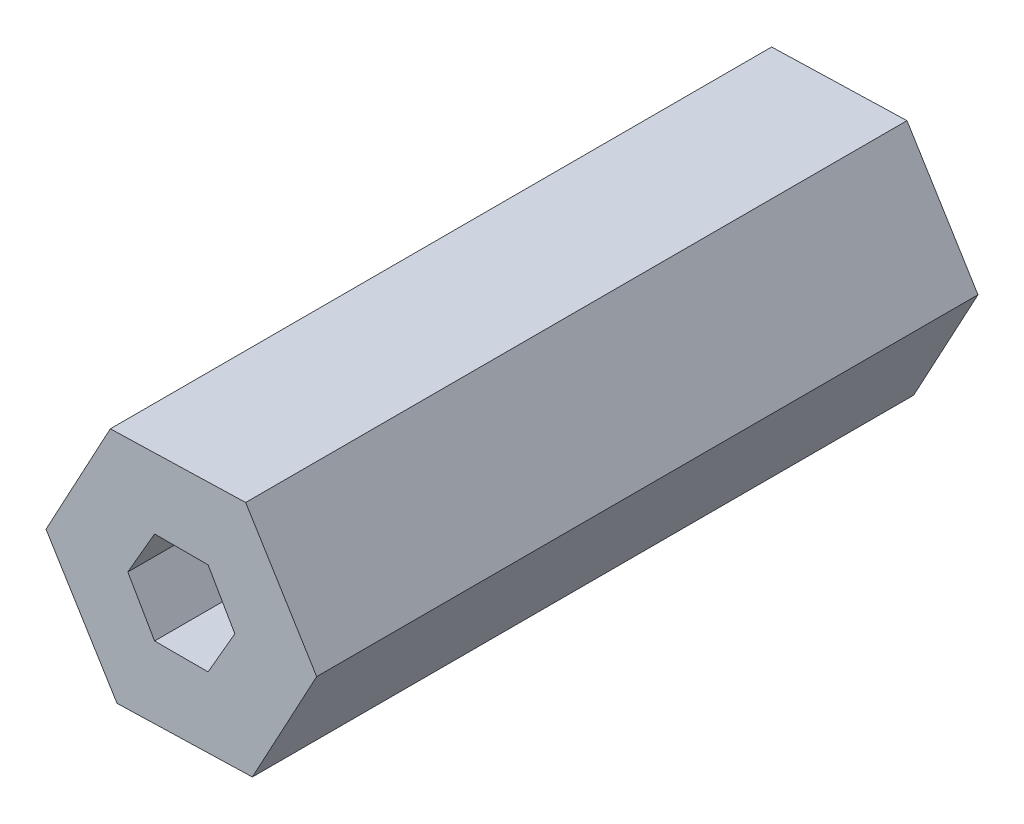
ISO-10303-21;
HEADER;
FILE_DESCRIPTION(('STEP AP214'),'2;1');
FILE_NAME('part.step','',(''),(''),'','','');
FILE_SCHEMA(('AUTOMOTIVE_DESIGN { 1 0 10303 214 1 1 1 1 }'));
ENDSEC;
DATA;
#1=APPLICATION_CONTEXT('core data for automotive mechanical design processes');
#2=APPLICATION_PROTOCOL_DEFINITION('international standard','automotive_design',2000,#1);
#3=PRODUCT_CONTEXT('',#1,'mechanical');
#4=PRODUCT('Part','Part','',(#3));
#5=PRODUCT_RELATED_PRODUCT_CATEGORY('part','',(#4));
#6=PRODUCT_DEFINITION_FORMATION('','',#4);
#7=PRODUCT_DEFINITION_CONTEXT('part definition',#1,'design');
#8=PRODUCT_DEFINITION('design','',#6,#7);
#9=PRODUCT_DEFINITION_SHAPE('','',#8);
#10=(LENGTH_UNIT() NAMED_UNIT(*) SI_UNIT(.MILLI.,.METRE.));
#11=(NAMED_UNIT(*) PLANE_ANGLE_UNIT() SI_UNIT($,.RADIAN.));
#12=(NAMED_UNIT(*) SI_UNIT($,.STERADIAN.) SOLID_ANGLE_UNIT());
#13=UNCERTAINTY_MEASURE_WITH_UNIT(LENGTH_MEASURE(1.E-05),#10,'distance_accuracy_value','');
#14=(GEOMETRIC_REPRESENTATION_CONTEXT(3) GLOBAL_UNCERTAINTY_ASSIGNED_CONTEXT((#13)) GLOBAL_UNIT_ASSIGNED_CONTEXT((#10,
#11,#12)) REPRESENTATION_CONTEXT('',''));
#15=CARTESIAN_POINT('',(0.,0.,0.));
#16=DIRECTION('',(0.,0.,1.));
#17=DIRECTION('',(1.,0.,0.));
#18=AXIS2_PLACEMENT_3D('',#15,#16,#17);
#19=CARTESIAN_POINT('',(2.17372376349894,-1.255,35.814));
#20=DIRECTION('',(-0.866025403784439,0.5,0.));
#21=DIRECTION('',(-0.5,-0.866025403784439,0.));
#22=AXIS2_PLACEMENT_3D('',#19,#20,#21);
#23=PLANE('',#22);
#24=DIRECTION('',(0.5,0.866025403784439,0.));
#25=VECTOR('',#24,1.);
#26=CARTESIAN_POINT('',(2.17372376349894,-1.255,0.));
#27=LINE('',#26,#25);
#28=CARTESIAN_POINT('',(1.44914917566596,-2.51,0.));
#29=VERTEX_POINT('',#28);
#30=CARTESIAN_POINT('',(2.89829835133192,0.,0.));
#31=VERTEX_POINT('',#30);
#32=EDGE_CURVE('E189',#29,#31,#27,.T.);
#33=ORIENTED_EDGE('',*,*,#32,.F.);
#34=DIRECTION('',(0.,0.,-1.));
#35=VECTOR('',#34,1.);
#36=CARTESIAN_POINT('',(1.44914917566596,-2.51,35.814));
#37=LINE('',#36,#35);
#38=CARTESIAN_POINT('',(1.44914917566596,-2.51,35.814));
#39=VERTEX_POINT('',#38);
#40=EDGE_CURVE('E11',#39,#29,#37,.T.);
#41=ORIENTED_EDGE('',*,*,#40,.F.);
#42=DIRECTION('',(0.5,0.866025403784439,0.));
#43=VECTOR('',#42,1.);
#44=CARTESIAN_POINT('',(2.17372376349894,-1.255,35.814));
#45=LINE('',#44,#43);
#46=CARTESIAN_POINT('',(2.89829835133192,0.,35.814));
#47=VERTEX_POINT('',#46);
#48=EDGE_CURVE('E273',#39,#47,#45,.T.);
#49=ORIENTED_EDGE('',*,*,#48,.T.);
#50=DIRECTION('',(0.,0.,-1.));
#51=VECTOR('',#50,1.);
#52=CARTESIAN_POINT('',(2.89829835133192,0.,35.814));
#53=LINE('',#52,#51);
#54=EDGE_CURVE('E59',#47,#31,#53,.T.);
#55=ORIENTED_EDGE('',*,*,#54,.T.);
#56=EDGE_LOOP('',(#33,#41,#49,#55));
#57=FACE_BOUND('',#56,.T.);
#58=ADVANCED_FACE('F39',(#57),#23,.T.);
#59=CARTESIAN_POINT('',(0.,-2.51,35.814));
#60=DIRECTION('',(0.,1.,0.));
#61=DIRECTION('',(0.,0.,1.));
#62=AXIS2_PLACEMENT_3D('',#59,#60,#61);
#63=PLANE('',#62);
#64=DIRECTION('',(1.,0.,0.));
#65=VECTOR('',#64,1.);
#66=CARTESIAN_POINT('',(0.,-2.51,0.));
#67=LINE('',#66,#65);
#68=CARTESIAN_POINT('',(-1.44914917566596,-2.51,0.));
#69=VERTEX_POINT('',#68);
#70=EDGE_CURVE('E192',#69,#29,#67,.T.);
#71=ORIENTED_EDGE('',*,*,#70,.F.);
#72=DIRECTION('',(0.,0.,-1.));
#73=VECTOR('',#72,1.);
#74=CARTESIAN_POINT('',(-1.44914917566596,-2.51,35.814));
#75=LINE('',#74,#73);
#76=CARTESIAN_POINT('',(-1.44914917566596,-2.51,35.814));
#77=VERTEX_POINT('',#76);
#78=EDGE_CURVE('E50',#77,#69,#75,.T.);
#79=ORIENTED_EDGE('',*,*,#78,.F.);
#80=DIRECTION('',(1.,0.,0.));
#81=VECTOR('',#80,1.);
#82=CARTESIAN_POINT('',(0.,-2.51,35.814));
#83=LINE('',#82,#81);
#84=EDGE_CURVE('E276',#77,#39,#83,.T.);
#85=ORIENTED_EDGE('',*,*,#84,.T.);
#86=ORIENTED_EDGE('',*,*,#40,.T.);
#87=EDGE_LOOP('',(#71,#79,#85,#86));
#88=FACE_BOUND('',#87,.T.);
#89=ADVANCED_FACE('F299',(#88),#63,.T.);
#90=CARTESIAN_POINT('',(-2.17372376349894,-1.255,35.814));
#91=DIRECTION('',(0.866025403784439,0.5,0.));
#92=DIRECTION('',(-0.5,0.866025403784439,0.));
#93=AXIS2_PLACEMENT_3D('',#90,#91,#92);
#94=PLANE('',#93);
#95=DIRECTION('',(0.5,-0.866025403784439,0.));
#96=VECTOR('',#95,1.);
#97=CARTESIAN_POINT('',(-2.17372376349894,-1.255,0.));
#98=LINE('',#97,#96);
#99=CARTESIAN_POINT('',(-2.89829835133192,0.,0.));
#100=VERTEX_POINT('',#99);
#101=EDGE_CURVE('E196',#100,#69,#98,.T.);
#102=ORIENTED_EDGE('',*,*,#101,.F.);
#103=DIRECTION('',(0.,0.,-1.));
#104=VECTOR('',#103,1.);
#105=CARTESIAN_POINT('',(-2.89829835133192,0.,35.814));
#106=LINE('',#105,#104);
#107=CARTESIAN_POINT('',(-2.89829835133192,0.,35.814));
#108=VERTEX_POINT('',#107);
#109=EDGE_CURVE('E147',#108,#100,#106,.T.);
#110=ORIENTED_EDGE('',*,*,#109,.F.);
#111=DIRECTION('',(0.5,-0.866025403784439,0.));
#112=VECTOR('',#111,1.);
#113=CARTESIAN_POINT('',(-2.17372376349894,-1.255,35.814));
#114=LINE('',#113,#112);
#115=EDGE_CURVE('E158',#108,#77,#114,.T.);
#116=ORIENTED_EDGE('',*,*,#115,.T.);
#117=ORIENTED_EDGE('',*,*,#78,.T.);
#118=EDGE_LOOP('',(#102,#110,#116,#117));
#119=FACE_BOUND('',#118,.T.);
#120=ADVANCED_FACE('F282',(#119),#94,.T.);
#121=CARTESIAN_POINT('',(-2.17372376349894,1.255,35.814));
#122=DIRECTION('',(0.866025403784439,-0.499999999999999,0.));
#123=DIRECTION('',(0.499999999999999,0.866025403784439,0.));
#124=AXIS2_PLACEMENT_3D('',#121,#122,#123);
#125=PLANE('',#124);
#126=DIRECTION('',(-0.499999999999999,-0.866025403784439,0.));
#127=VECTOR('',#126,1.);
#128=CARTESIAN_POINT('',(-2.17372376349894,1.255,0.));
#129=LINE('',#128,#127);
#130=CARTESIAN_POINT('',(-1.44914917566596,2.51,0.));
#131=VERTEX_POINT('',#130);
#132=EDGE_CURVE('E142',#131,#100,#129,.T.);
#133=ORIENTED_EDGE('',*,*,#132,.F.);
#134=DIRECTION('',(0.,0.,-1.));
#135=VECTOR('',#134,1.);
#136=CARTESIAN_POINT('',(-1.44914917566596,2.51,35.814));
#137=LINE('',#136,#135);
#138=CARTESIAN_POINT('',(-1.44914917566596,2.51,35.814));
#139=VERTEX_POINT('',#138);
#140=EDGE_CURVE('E137',#139,#131,#137,.T.);
#141=ORIENTED_EDGE('',*,*,#140,.F.);
#142=DIRECTION('',(-0.499999999999999,-0.866025403784439,0.));
#143=VECTOR('',#142,1.);
#144=CARTESIAN_POINT('',(-2.17372376349894,1.255,35.814));
#145=LINE('',#144,#143);
#146=EDGE_CURVE('E140',#139,#108,#145,.T.);
#147=ORIENTED_EDGE('',*,*,#146,.T.);
#148=ORIENTED_EDGE('',*,*,#109,.T.);
#149=EDGE_LOOP('',(#133,#141,#147,#148));
#150=FACE_BOUND('',#149,.T.);
#151=ADVANCED_FACE('F139',(#150),#125,.T.);
#152=CARTESIAN_POINT('',(0.,2.51,35.814));
#153=DIRECTION('',(0.,-1.,0.));
#154=DIRECTION('',(1.,0.,0.));
#155=AXIS2_PLACEMENT_3D('',#152,#153,#154);
#156=PLANE('',#155);
#157=DIRECTION('',(-1.,0.,0.));
#158=VECTOR('',#157,1.);
#159=CARTESIAN_POINT('',(0.,2.51,0.));
#160=LINE('',#159,#158);
#161=CARTESIAN_POINT('',(1.44914917566596,2.51,0.));
#162=VERTEX_POINT('',#161);
#163=EDGE_CURVE('E202',#162,#131,#160,.T.);
#164=ORIENTED_EDGE('',*,*,#163,.F.);
#165=DIRECTION('',(0.,0.,-1.));
#166=VECTOR('',#165,1.);
#167=CARTESIAN_POINT('',(1.44914917566596,2.51,35.814));
#168=LINE('',#167,#166);
#169=CARTESIAN_POINT('',(1.44914917566596,2.51,35.814));
#170=VERTEX_POINT('',#169);
#171=EDGE_CURVE('E96',#170,#162,#168,.T.);
#172=ORIENTED_EDGE('',*,*,#171,.F.);
#173=DIRECTION('',(-1.,0.,0.));
#174=VECTOR('',#173,1.);
#175=CARTESIAN_POINT('',(0.,2.51,35.814));
#176=LINE('',#175,#174);
#177=EDGE_CURVE('E155',#170,#139,#176,.T.);
#178=ORIENTED_EDGE('',*,*,#177,.T.);
#179=ORIENTED_EDGE('',*,*,#140,.T.);
#180=EDGE_LOOP('',(#164,#172,#178,#179));
#181=FACE_BOUND('',#180,.T.);
#182=ADVANCED_FACE('F161',(#181),#156,.T.);
#183=CARTESIAN_POINT('',(0.181123048573286,-6.34741635953364,35.814));
#184=DIRECTION('',(-0.0285233147359507,0.999593127485615,0.));
#185=DIRECTION('',(-0.999593127485616,-0.0285233147359507,0.));
#186=AXIS2_PLACEMENT_3D('',#183,#184,#185);
#187=PLANE('',#186);
#188=DIRECTION('',(0.999593127485616,0.0285233147359507,0.));
#189=VECTOR('',#188,1.);
#190=CARTESIAN_POINT('',(0.181123048573286,-6.34741635953364,0.));
#191=LINE('',#190,#189);
#192=CARTESIAN_POINT('',(-3.4835594952621,-6.45198780038387,0.));
#193=VERTEX_POINT('',#192);
#194=CARTESIAN_POINT('',(3.84580559240867,-6.24284491868341,0.));
#195=VERTEX_POINT('',#194);
#196=EDGE_CURVE('E170',#193,#195,#191,.T.);
#197=ORIENTED_EDGE('',*,*,#196,.T.);
#198=DIRECTION('',(0.,0.,-1.));
#199=VECTOR('',#198,1.);
#200=CARTESIAN_POINT('',(3.84580559240867,-6.24284491868341,35.814));
#201=LINE('',#200,#199);
#202=CARTESIAN_POINT('',(3.84580559240867,-6.24284491868341,35.814));
#203=VERTEX_POINT('',#202);
#204=EDGE_CURVE('E43',#203,#195,#201,.T.);
#205=ORIENTED_EDGE('',*,*,#204,.F.);
#206=DIRECTION('',(0.999593127485616,0.0285233147359507,0.));
#207=VECTOR('',#206,1.);
#208=CARTESIAN_POINT('',(0.181123048573286,-6.34741635953364,35.814));
#209=LINE('',#208,#207);
#210=CARTESIAN_POINT('',(-3.4835594952621,-6.45198780038387,35.814));
#211=VERTEX_POINT('',#210);
#212=EDGE_CURVE('E209',#211,#203,#209,.T.);
#213=ORIENTED_EDGE('',*,*,#212,.F.);
#214=DIRECTION('',(0.,0.,-1.));
#215=VECTOR('',#214,1.);
#216=CARTESIAN_POINT('',(-3.4835594952621,-6.45198780038387,35.814));
#217=LINE('',#216,#215);
#218=EDGE_CURVE('E166',#211,#193,#217,.T.);
#219=ORIENTED_EDGE('',*,*,#218,.T.);
#220=EDGE_LOOP('',(#197,#205,#213,#219));
#221=FACE_BOUND('',#220,.T.);
#222=ADVANCED_FACE('F41',(#221),#187,.F.);
#223=CARTESIAN_POINT('',(5.58758534003972,-3.01685101849147,35.814));
#224=DIRECTION('',(-0.879934699218855,0.475094648581335,0.));
#225=DIRECTION('',(-0.475094648581335,-0.879934699218855,0.));
#226=AXIS2_PLACEMENT_3D('',#223,#224,#225);
#227=PLANE('',#226);
#228=DIRECTION('',(0.475094648581335,0.879934699218855,0.));
#229=VECTOR('',#228,1.);
#230=CARTESIAN_POINT('',(5.58758534003972,-3.01685101849147,0.));
#231=LINE('',#230,#229);
#232=CARTESIAN_POINT('',(7.32936508767077,0.209142881700465,0.));
#233=VERTEX_POINT('',#232);
#234=EDGE_CURVE('E174',#195,#233,#231,.T.);
#235=ORIENTED_EDGE('',*,*,#234,.T.);
#236=DIRECTION('',(0.,0.,-1.));
#237=VECTOR('',#236,1.);
#238=CARTESIAN_POINT('',(7.32936508767077,0.209142881700465,35.814));
#239=LINE('',#238,#237);
#240=CARTESIAN_POINT('',(7.32936508767077,0.209142881700465,35.814));
#241=VERTEX_POINT('',#240);
#242=EDGE_CURVE('E232',#241,#233,#239,.T.);
#243=ORIENTED_EDGE('',*,*,#242,.F.);
#244=DIRECTION('',(0.475094648581335,0.879934699218855,0.));
#245=VECTOR('',#244,1.);
#246=CARTESIAN_POINT('',(5.58758534003972,-3.01685101849147,35.814));
#247=LINE('',#246,#245);
#248=EDGE_CURVE('E109',#203,#241,#247,.T.);
#249=ORIENTED_EDGE('',*,*,#248,.F.);
#250=ORIENTED_EDGE('',*,*,#204,.T.);
#251=EDGE_LOOP('',(#235,#243,#249,#250));
#252=FACE_BOUND('',#251,.T.);
#253=ADVANCED_FACE('F240',(#252),#227,.F.);
#254=CARTESIAN_POINT('',(5.40646229146643,3.33056534104217,35.814));
#255=DIRECTION('',(-0.851411384482905,-0.52449847890428,0.));
#256=DIRECTION('',(0.52449847890428,-0.851411384482905,0.));
#257=AXIS2_PLACEMENT_3D('',#254,#255,#256);
#258=PLANE('',#257);
#259=DIRECTION('',(-0.52449847890428,0.851411384482905,0.));
#260=VECTOR('',#259,1.);
#261=CARTESIAN_POINT('',(5.40646229146643,3.33056534104217,0.));
#262=LINE('',#261,#260);
#263=CARTESIAN_POINT('',(3.4835594952621,6.45198780038387,0.));
#264=VERTEX_POINT('',#263);
#265=EDGE_CURVE('E177',#233,#264,#262,.T.);
#266=ORIENTED_EDGE('',*,*,#265,.T.);
#267=DIRECTION('',(0.,0.,-1.));
#268=VECTOR('',#267,1.);
#269=CARTESIAN_POINT('',(3.4835594952621,6.45198780038387,35.814));
#270=LINE('',#269,#268);
#271=CARTESIAN_POINT('',(3.4835594952621,6.45198780038387,35.814));
#272=VERTEX_POINT('',#271);
#273=EDGE_CURVE('E229',#272,#264,#270,.T.);
#274=ORIENTED_EDGE('',*,*,#273,.F.);
#275=DIRECTION('',(-0.52449847890428,0.851411384482905,0.));
#276=VECTOR('',#275,1.);
#277=CARTESIAN_POINT('',(5.40646229146643,3.33056534104217,35.814));
#278=LINE('',#277,#276);
#279=EDGE_CURVE('E262',#241,#272,#278,.T.);
#280=ORIENTED_EDGE('',*,*,#279,.F.);
#281=ORIENTED_EDGE('',*,*,#242,.T.);
#282=EDGE_LOOP('',(#266,#274,#280,#281));
#283=FACE_BOUND('',#282,.T.);
#284=ADVANCED_FACE('F252',(#283),#258,.F.);
#285=CARTESIAN_POINT('',(-0.181123048573286,6.34741635953364,35.814));
#286=DIRECTION('',(0.0285233147359506,-0.999593127485616,0.));
#287=DIRECTION('',(0.999593127485616,0.0285233147359506,0.));
#288=AXIS2_PLACEMENT_3D('',#285,#286,#287);
#289=PLANE('',#288);
#290=DIRECTION('',(-0.999593127485616,-0.0285233147359506,0.));
#291=VECTOR('',#290,1.);
#292=CARTESIAN_POINT('',(-0.181123048573286,6.34741635953364,0.));
#293=LINE('',#292,#291);
#294=CARTESIAN_POINT('',(-3.84580559240867,6.24284491868341,0.));
#295=VERTEX_POINT('',#294);
#296=EDGE_CURVE('E180',#264,#295,#293,.T.);
#297=ORIENTED_EDGE('',*,*,#296,.T.);
#298=DIRECTION('',(0.,0.,-1.));
#299=VECTOR('',#298,1.);
#300=CARTESIAN_POINT('',(-3.84580559240867,6.24284491868341,35.814));
#301=LINE('',#300,#299);
#302=CARTESIAN_POINT('',(-3.84580559240867,6.24284491868341,35.814));
#303=VERTEX_POINT('',#302);
#304=EDGE_CURVE('E225',#303,#295,#301,.T.);
#305=ORIENTED_EDGE('',*,*,#304,.F.);
#306=DIRECTION('',(-0.999593127485616,-0.0285233147359506,0.));
#307=VECTOR('',#306,1.);
#308=CARTESIAN_POINT('',(-0.181123048573286,6.34741635953364,35.814));
#309=LINE('',#308,#307);
#310=EDGE_CURVE('E257',#272,#303,#309,.T.);
#311=ORIENTED_EDGE('',*,*,#310,.F.);
#312=ORIENTED_EDGE('',*,*,#273,.T.);
#313=EDGE_LOOP('',(#297,#305,#311,#312));
#314=FACE_BOUND('',#313,.T.);
#315=ADVANCED_FACE('F255',(#314),#289,.F.);
#316=CARTESIAN_POINT('',(-5.58758534003972,3.01685101849147,35.814));
#317=DIRECTION('',(0.879934699218856,-0.475094648581335,0.));
#318=DIRECTION('',(0.475094648581335,0.879934699218856,0.));
#319=AXIS2_PLACEMENT_3D('',#316,#317,#318);
#320=PLANE('',#319);
#321=DIRECTION('',(-0.475094648581335,-0.879934699218855,0.));
#322=VECTOR('',#321,1.);
#323=CARTESIAN_POINT('',(-5.58758534003972,3.01685101849147,0.));
#324=LINE('',#323,#322);
#325=CARTESIAN_POINT('',(-7.32936508767076,-0.209142881700466,0.));
#326=VERTEX_POINT('',#325);
#327=EDGE_CURVE('E183',#295,#326,#324,.T.);
#328=ORIENTED_EDGE('',*,*,#327,.T.);
#329=DIRECTION('',(0.,0.,-1.));
#330=VECTOR('',#329,1.);
#331=CARTESIAN_POINT('',(-7.32936508767076,-0.209142881700466,35.814));
#332=LINE('',#331,#330);
#333=CARTESIAN_POINT('',(-7.32936508767076,-0.209142881700466,35.814));
#334=VERTEX_POINT('',#333);
#335=EDGE_CURVE('E221',#334,#326,#332,.T.);
#336=ORIENTED_EDGE('',*,*,#335,.F.);
#337=DIRECTION('',(-0.475094648581335,-0.879934699218855,0.));
#338=VECTOR('',#337,1.);
#339=CARTESIAN_POINT('',(-5.58758534003972,3.01685101849147,35.814));
#340=LINE('',#339,#338);
#341=EDGE_CURVE('E261',#303,#334,#340,.T.);
#342=ORIENTED_EDGE('',*,*,#341,.F.);
#343=ORIENTED_EDGE('',*,*,#304,.T.);
#344=EDGE_LOOP('',(#328,#336,#342,#343));
#345=FACE_BOUND('',#344,.T.);
#346=ADVANCED_FACE('F293',(#345),#320,.F.);
#347=CARTESIAN_POINT('',(-5.40646229146643,-3.33056534104217,35.814));
#348=DIRECTION('',(0.851411384482905,0.52449847890428,0.));
#349=DIRECTION('',(-0.52449847890428,0.851411384482905,0.));
#350=AXIS2_PLACEMENT_3D('',#347,#348,#349);
#351=PLANE('',#350);
#352=DIRECTION('',(0.52449847890428,-0.851411384482905,0.));
#353=VECTOR('',#352,1.);
#354=CARTESIAN_POINT('',(-5.40646229146643,-3.33056534104217,0.));
#355=LINE('',#354,#353);
#356=EDGE_CURVE('E186',#326,#193,#355,.T.);
#357=ORIENTED_EDGE('',*,*,#356,.T.);
#358=ORIENTED_EDGE('',*,*,#218,.F.);
#359=DIRECTION('',(0.52449847890428,-0.851411384482905,0.));
#360=VECTOR('',#359,1.);
#361=CARTESIAN_POINT('',(-5.40646229146643,-3.33056534104217,35.814));
#362=LINE('',#361,#360);
#363=EDGE_CURVE('E266',#334,#211,#362,.T.);
#364=ORIENTED_EDGE('',*,*,#363,.F.);
#365=ORIENTED_EDGE('',*,*,#335,.T.);
#366=EDGE_LOOP('',(#357,#358,#364,#365));
#367=FACE_BOUND('',#366,.T.);
#368=ADVANCED_FACE('F286',(#367),#351,.F.);
#369=CARTESIAN_POINT('',(2.17372376349894,1.255,35.814));
#370=DIRECTION('',(-0.866025403784439,-0.5,0.));
#371=DIRECTION('',(0.5,-0.866025403784439,0.));
#372=AXIS2_PLACEMENT_3D('',#369,#370,#371);
#373=PLANE('',#372);
#374=DIRECTION('',(-0.5,0.866025403784439,0.));
#375=VECTOR('',#374,1.);
#376=CARTESIAN_POINT('',(2.17372376349894,1.255,0.));
#377=LINE('',#376,#375);
#378=EDGE_CURVE('E205',#31,#162,#377,.T.);
#379=ORIENTED_EDGE('',*,*,#378,.F.);
#380=ORIENTED_EDGE('',*,*,#54,.F.);
#381=DIRECTION('',(-0.5,0.866025403784439,0.));
#382=VECTOR('',#381,1.);
#383=CARTESIAN_POINT('',(2.17372376349894,1.255,35.814));
#384=LINE('',#383,#382);
#385=EDGE_CURVE('E163',#47,#170,#384,.T.);
#386=ORIENTED_EDGE('',*,*,#385,.T.);
#387=ORIENTED_EDGE('',*,*,#171,.T.);
#388=EDGE_LOOP('',(#379,#380,#386,#387));
#389=FACE_BOUND('',#388,.T.);
#390=ADVANCED_FACE('F284',(#389),#373,.T.);
#391=CARTESIAN_POINT('',(0.,0.,35.814));
#392=DIRECTION('',(0.,0.,1.));
#393=DIRECTION('',(1.,0.,0.));
#394=AXIS2_PLACEMENT_3D('',#391,#392,#393);
#395=PLANE('',#394);
#396=ORIENTED_EDGE('',*,*,#212,.T.);
#397=ORIENTED_EDGE('',*,*,#248,.T.);
#398=ORIENTED_EDGE('',*,*,#279,.T.);
#399=ORIENTED_EDGE('',*,*,#310,.T.);
#400=ORIENTED_EDGE('',*,*,#341,.T.);
#401=ORIENTED_EDGE('',*,*,#363,.T.);
#402=EDGE_LOOP('',(#396,#397,#398,#399,#400,#401));
#403=FACE_BOUND('',#402,.T.);
#404=ORIENTED_EDGE('',*,*,#48,.F.);
#405=ORIENTED_EDGE('',*,*,#84,.F.);
#406=ORIENTED_EDGE('',*,*,#115,.F.);
#407=ORIENTED_EDGE('',*,*,#146,.F.);
#408=ORIENTED_EDGE('',*,*,#177,.F.);
#409=ORIENTED_EDGE('',*,*,#385,.F.);
#410=EDGE_LOOP('',(#404,#405,#406,#407,#408,#409));
#411=FACE_BOUND('',#410,.T.);
#412=ADVANCED_FACE('F153',(#403,#411),#395,.T.);
#413=CARTESIAN_POINT('',(0.,0.,0.));
#414=DIRECTION('',(0.,0.,1.));
#415=DIRECTION('',(1.,0.,0.));
#416=AXIS2_PLACEMENT_3D('',#413,#414,#415);
#417=PLANE('',#416);
#418=ORIENTED_EDGE('',*,*,#196,.F.);
#419=ORIENTED_EDGE('',*,*,#356,.F.);
#420=ORIENTED_EDGE('',*,*,#327,.F.);
#421=ORIENTED_EDGE('',*,*,#296,.F.);
#422=ORIENTED_EDGE('',*,*,#265,.F.);
#423=ORIENTED_EDGE('',*,*,#234,.F.);
#424=EDGE_LOOP('',(#418,#419,#420,#421,#422,#423));
#425=FACE_BOUND('',#424,.T.);
#426=ORIENTED_EDGE('',*,*,#32,.T.);
#427=ORIENTED_EDGE('',*,*,#378,.T.);
#428=ORIENTED_EDGE('',*,*,#163,.T.);
#429=ORIENTED_EDGE('',*,*,#132,.T.);
#430=ORIENTED_EDGE('',*,*,#101,.T.);
#431=ORIENTED_EDGE('',*,*,#70,.T.);
#432=EDGE_LOOP('',(#426,#427,#428,#429,#430,#431));
#433=FACE_BOUND('',#432,.T.);
#434=ADVANCED_FACE('F247',(#425,#433),#417,.F.);
#435=CLOSED_SHELL('',(#58,#89,#120,#151,#182,#222,#253,#284,#315,#346,#368,#390,#412,#434));
#436=MANIFOLD_SOLID_BREP('B2',#435);
#437=ADVANCED_BREP_SHAPE_REPRESENTATION('',(#18,#436),#14);
#438=SHAPE_DEFINITION_REPRESENTATION(#9,#437);
ENDSEC;
END-ISO-10303-21;
